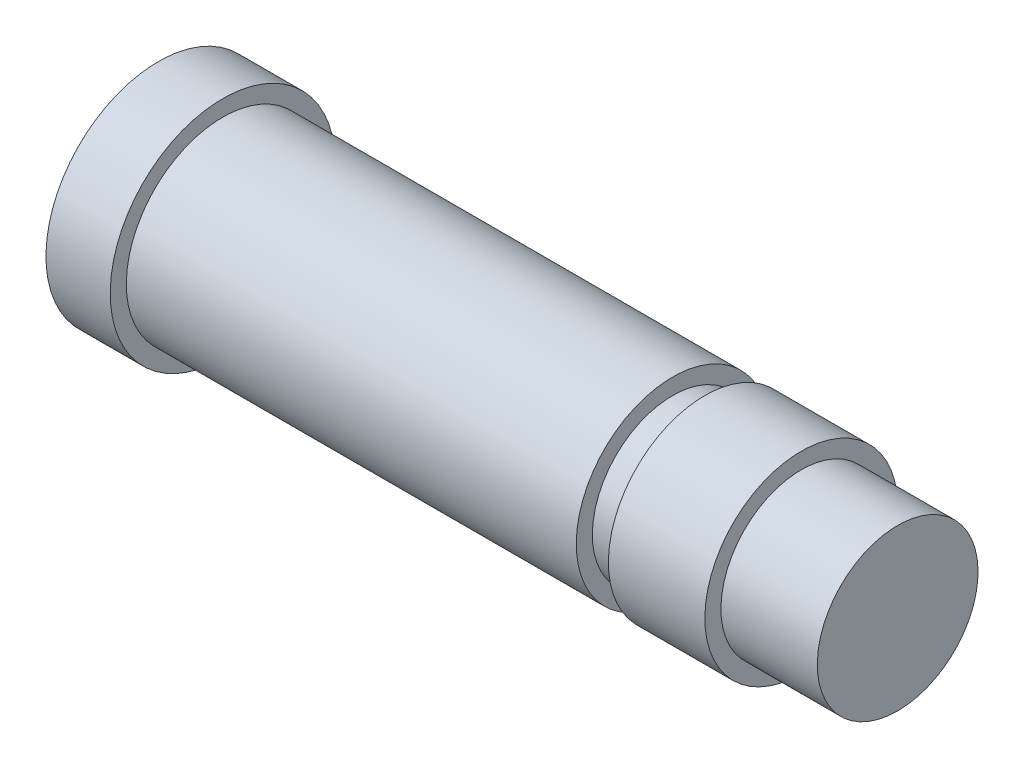
ISO-10303-21;
HEADER;
FILE_DESCRIPTION(('STEP AP214'),'2;1');
FILE_NAME('part.step','',(''),(''),'','','');
FILE_SCHEMA(('AUTOMOTIVE_DESIGN { 1 0 10303 214 1 1 1 1 }'));
ENDSEC;
DATA;
#1=APPLICATION_CONTEXT('core data for automotive mechanical design processes');
#2=APPLICATION_PROTOCOL_DEFINITION('international standard','automotive_design',2000,#1);
#3=PRODUCT_CONTEXT('',#1,'mechanical');
#4=PRODUCT('Part','Part','',(#3));
#5=PRODUCT_RELATED_PRODUCT_CATEGORY('part','',(#4));
#6=PRODUCT_DEFINITION_FORMATION('','',#4);
#7=PRODUCT_DEFINITION_CONTEXT('part definition',#1,'design');
#8=PRODUCT_DEFINITION('design','',#6,#7);
#9=PRODUCT_DEFINITION_SHAPE('','',#8);
#10=(LENGTH_UNIT() NAMED_UNIT(*) SI_UNIT(.MILLI.,.METRE.));
#11=(NAMED_UNIT(*) PLANE_ANGLE_UNIT() SI_UNIT($,.RADIAN.));
#12=(NAMED_UNIT(*) SI_UNIT($,.STERADIAN.) SOLID_ANGLE_UNIT());
#13=UNCERTAINTY_MEASURE_WITH_UNIT(LENGTH_MEASURE(1.E-05),#10,'distance_accuracy_value','');
#14=(GEOMETRIC_REPRESENTATION_CONTEXT(3) GLOBAL_UNCERTAINTY_ASSIGNED_CONTEXT((#13)) GLOBAL_UNIT_ASSIGNED_CONTEXT((#10,
#11,#12)) REPRESENTATION_CONTEXT('',''));
#15=CARTESIAN_POINT('',(0.,0.,0.));
#16=DIRECTION('',(0.,0.,1.));
#17=DIRECTION('',(1.,0.,0.));
#18=AXIS2_PLACEMENT_3D('',#15,#16,#17);
#19=CARTESIAN_POINT('',(0.,7.,0.));
#20=DIRECTION('',(1.,0.,0.));
#21=DIRECTION('',(0.,1.,0.));
#22=AXIS2_PLACEMENT_3D('',#19,#20,#21);
#23=PLANE('',#22);
#24=CARTESIAN_POINT('',(0.,0.,0.));
#25=DIRECTION('',(-1.,0.,0.));
#26=DIRECTION('',(0.,-1.,0.));
#27=AXIS2_PLACEMENT_3D('',#24,#25,#26);
#28=CIRCLE('',#27,7.);
#29=CARTESIAN_POINT('',(0.,-7.,0.));
#30=VERTEX_POINT('',#29);
#31=EDGE_CURVE('E92',#30,#30,#28,.T.);
#32=ORIENTED_EDGE('',*,*,#31,.T.);
#33=EDGE_LOOP('',(#32));
#34=FACE_BOUND('',#33,.T.);
#35=ADVANCED_FACE('F49',(#34),#23,.F.);
#36=CARTESIAN_POINT('',(46.,5.00000000000001,0.));
#37=DIRECTION('',(-1.,0.,0.));
#38=DIRECTION('',(0.,-1.,0.));
#39=AXIS2_PLACEMENT_3D('',#36,#37,#38);
#40=PLANE('',#39);
#41=CARTESIAN_POINT('',(46.,0.,0.));
#42=DIRECTION('',(-1.,0.,0.));
#43=DIRECTION('',(0.,-1.,0.));
#44=AXIS2_PLACEMENT_3D('',#41,#42,#43);
#45=CIRCLE('',#44,5.);
#46=CARTESIAN_POINT('',(46.,-5.,0.));
#47=VERTEX_POINT('',#46);
#48=EDGE_CURVE('E10',#47,#47,#45,.T.);
#49=ORIENTED_EDGE('',*,*,#48,.F.);
#50=EDGE_LOOP('',(#49));
#51=FACE_BOUND('',#50,.T.);
#52=ADVANCED_FACE('F148',(#51),#40,.F.);
#53=CARTESIAN_POINT('',(0.,0.,0.));
#54=DIRECTION('',(-1.,0.,0.));
#55=DIRECTION('',(0.,-1.,0.));
#56=AXIS2_PLACEMENT_3D('',#53,#54,#55);
#57=CYLINDRICAL_SURFACE('',#56,5.);
#58=CARTESIAN_POINT('',(40.,0.,0.));
#59=DIRECTION('',(-1.,0.,0.));
#60=DIRECTION('',(0.,-1.,0.));
#61=AXIS2_PLACEMENT_3D('',#58,#59,#60);
#62=CIRCLE('',#61,5.);
#63=CARTESIAN_POINT('',(40.,-4.99999999999999,0.));
#64=VERTEX_POINT('',#63);
#65=EDGE_CURVE('E56',#64,#64,#62,.T.);
#66=ORIENTED_EDGE('',*,*,#65,.F.);
#67=EDGE_LOOP('',(#66));
#68=FACE_BOUND('',#67,.T.);
#69=ORIENTED_EDGE('',*,*,#48,.T.);
#70=EDGE_LOOP('',(#69));
#71=FACE_BOUND('',#70,.T.);
#72=ADVANCED_FACE('F142',(#68,#71),#57,.T.);
#73=CARTESIAN_POINT('',(40.,5.,0.));
#74=DIRECTION('',(-1.,0.,0.));
#75=DIRECTION('',(0.,-1.,0.));
#76=AXIS2_PLACEMENT_3D('',#73,#74,#75);
#77=PLANE('',#76);
#78=CARTESIAN_POINT('',(40.,0.,0.));
#79=DIRECTION('',(-1.,0.,0.));
#80=DIRECTION('',(0.,-1.,0.));
#81=AXIS2_PLACEMENT_3D('',#78,#79,#80);
#82=CIRCLE('',#81,6.);
#83=CARTESIAN_POINT('',(40.,-6.,0.));
#84=VERTEX_POINT('',#83);
#85=EDGE_CURVE('E61',#84,#84,#82,.T.);
#86=ORIENTED_EDGE('',*,*,#85,.F.);
#87=EDGE_LOOP('',(#86));
#88=FACE_BOUND('',#87,.T.);
#89=ORIENTED_EDGE('',*,*,#65,.T.);
#90=EDGE_LOOP('',(#89));
#91=FACE_BOUND('',#90,.T.);
#92=ADVANCED_FACE('F137',(#88,#91),#77,.F.);
#93=CARTESIAN_POINT('',(0.,0.,0.));
#94=DIRECTION('',(-1.,0.,0.));
#95=DIRECTION('',(0.,-1.,0.));
#96=AXIS2_PLACEMENT_3D('',#93,#94,#95);
#97=CYLINDRICAL_SURFACE('',#96,6.);
#98=CARTESIAN_POINT('',(34.,0.,0.));
#99=DIRECTION('',(-1.,0.,0.));
#100=DIRECTION('',(0.,-1.,0.));
#101=AXIS2_PLACEMENT_3D('',#98,#99,#100);
#102=CIRCLE('',#101,6.);
#103=CARTESIAN_POINT('',(34.,-5.99999999999999,0.));
#104=VERTEX_POINT('',#103);
#105=EDGE_CURVE('E66',#104,#104,#102,.T.);
#106=ORIENTED_EDGE('',*,*,#105,.F.);
#107=EDGE_LOOP('',(#106));
#108=FACE_BOUND('',#107,.T.);
#109=ORIENTED_EDGE('',*,*,#85,.T.);
#110=EDGE_LOOP('',(#109));
#111=FACE_BOUND('',#110,.T.);
#112=ADVANCED_FACE('F131',(#108,#111),#97,.T.);
#113=CARTESIAN_POINT('',(34.,6.,0.));
#114=DIRECTION('',(1.,0.,0.));
#115=DIRECTION('',(0.,1.,0.));
#116=AXIS2_PLACEMENT_3D('',#113,#114,#115);
#117=PLANE('',#116);
#118=CARTESIAN_POINT('',(34.,0.,0.));
#119=DIRECTION('',(-1.,0.,0.));
#120=DIRECTION('',(0.,-1.,0.));
#121=AXIS2_PLACEMENT_3D('',#118,#119,#120);
#122=CIRCLE('',#121,5.);
#123=CARTESIAN_POINT('',(34.,-4.99999999999999,0.));
#124=VERTEX_POINT('',#123);
#125=EDGE_CURVE('E72',#124,#124,#122,.T.);
#126=ORIENTED_EDGE('',*,*,#125,.F.);
#127=EDGE_LOOP('',(#126));
#128=FACE_BOUND('',#127,.T.);
#129=ORIENTED_EDGE('',*,*,#105,.T.);
#130=EDGE_LOOP('',(#129));
#131=FACE_BOUND('',#130,.T.);
#132=ADVANCED_FACE('F125',(#128,#131),#117,.F.);
#133=CARTESIAN_POINT('',(0.,0.,0.));
#134=DIRECTION('',(-1.,0.,0.));
#135=DIRECTION('',(0.,-1.,0.));
#136=AXIS2_PLACEMENT_3D('',#133,#134,#135);
#137=CYLINDRICAL_SURFACE('',#136,5.);
#138=CARTESIAN_POINT('',(32.,0.,0.));
#139=DIRECTION('',(-1.,0.,0.));
#140=DIRECTION('',(0.,-1.,0.));
#141=AXIS2_PLACEMENT_3D('',#138,#139,#140);
#142=CIRCLE('',#141,5.);
#143=CARTESIAN_POINT('',(32.,-4.99999999999999,0.));
#144=VERTEX_POINT('',#143);
#145=EDGE_CURVE('E76',#144,#144,#142,.T.);
#146=ORIENTED_EDGE('',*,*,#145,.F.);
#147=EDGE_LOOP('',(#146));
#148=FACE_BOUND('',#147,.T.);
#149=ORIENTED_EDGE('',*,*,#125,.T.);
#150=EDGE_LOOP('',(#149));
#151=FACE_BOUND('',#150,.T.);
#152=ADVANCED_FACE('F119',(#148,#151),#137,.T.);
#153=CARTESIAN_POINT('',(32.,5.,0.));
#154=DIRECTION('',(-1.,0.,0.));
#155=DIRECTION('',(0.,-1.,0.));
#156=AXIS2_PLACEMENT_3D('',#153,#154,#155);
#157=PLANE('',#156);
#158=CARTESIAN_POINT('',(32.,0.,0.));
#159=DIRECTION('',(-1.,0.,0.));
#160=DIRECTION('',(0.,-1.,0.));
#161=AXIS2_PLACEMENT_3D('',#158,#159,#160);
#162=CIRCLE('',#161,6.);
#163=CARTESIAN_POINT('',(32.,-6.,0.));
#164=VERTEX_POINT('',#163);
#165=EDGE_CURVE('E80',#164,#164,#162,.T.);
#166=ORIENTED_EDGE('',*,*,#165,.F.);
#167=EDGE_LOOP('',(#166));
#168=FACE_BOUND('',#167,.T.);
#169=ORIENTED_EDGE('',*,*,#145,.T.);
#170=EDGE_LOOP('',(#169));
#171=FACE_BOUND('',#170,.T.);
#172=ADVANCED_FACE('F113',(#168,#171),#157,.F.);
#173=CARTESIAN_POINT('',(0.,0.,0.));
#174=DIRECTION('',(-1.,0.,0.));
#175=DIRECTION('',(0.,-1.,0.));
#176=AXIS2_PLACEMENT_3D('',#173,#174,#175);
#177=CYLINDRICAL_SURFACE('',#176,6.);
#178=CARTESIAN_POINT('',(4.,0.,0.));
#179=DIRECTION('',(-1.,0.,0.));
#180=DIRECTION('',(0.,-1.,0.));
#181=AXIS2_PLACEMENT_3D('',#178,#179,#180);
#182=CIRCLE('',#181,6.);
#183=CARTESIAN_POINT('',(4.,-6.,0.));
#184=VERTEX_POINT('',#183);
#185=EDGE_CURVE('E84',#184,#184,#182,.T.);
#186=ORIENTED_EDGE('',*,*,#185,.F.);
#187=EDGE_LOOP('',(#186));
#188=FACE_BOUND('',#187,.T.);
#189=ORIENTED_EDGE('',*,*,#165,.T.);
#190=EDGE_LOOP('',(#189));
#191=FACE_BOUND('',#190,.T.);
#192=ADVANCED_FACE('F107',(#188,#191),#177,.T.);
#193=CARTESIAN_POINT('',(4.,6.,0.));
#194=DIRECTION('',(-1.,0.,0.));
#195=DIRECTION('',(0.,-1.,0.));
#196=AXIS2_PLACEMENT_3D('',#193,#194,#195);
#197=PLANE('',#196);
#198=CARTESIAN_POINT('',(4.,0.,0.));
#199=DIRECTION('',(-1.,0.,0.));
#200=DIRECTION('',(0.,-1.,0.));
#201=AXIS2_PLACEMENT_3D('',#198,#199,#200);
#202=CIRCLE('',#201,7.);
#203=CARTESIAN_POINT('',(4.,-7.,0.));
#204=VERTEX_POINT('',#203);
#205=EDGE_CURVE('E88',#204,#204,#202,.T.);
#206=ORIENTED_EDGE('',*,*,#205,.F.);
#207=EDGE_LOOP('',(#206));
#208=FACE_BOUND('',#207,.T.);
#209=ORIENTED_EDGE('',*,*,#185,.T.);
#210=EDGE_LOOP('',(#209));
#211=FACE_BOUND('',#210,.T.);
#212=ADVANCED_FACE('F101',(#208,#211),#197,.F.);
#213=CARTESIAN_POINT('',(0.,0.,0.));
#214=DIRECTION('',(-1.,0.,0.));
#215=DIRECTION('',(0.,-1.,0.));
#216=AXIS2_PLACEMENT_3D('',#213,#214,#215);
#217=CYLINDRICAL_SURFACE('',#216,7.);
#218=ORIENTED_EDGE('',*,*,#31,.F.);
#219=EDGE_LOOP('',(#218));
#220=FACE_BOUND('',#219,.T.);
#221=ORIENTED_EDGE('',*,*,#205,.T.);
#222=EDGE_LOOP('',(#221));
#223=FACE_BOUND('',#222,.T.);
#224=ADVANCED_FACE('F98',(#220,#223),#217,.T.);
#225=CLOSED_SHELL('',(#35,#52,#72,#92,#112,#132,#152,#172,#192,#212,#224));
#226=MANIFOLD_SOLID_BREP('B2',#225);
#227=ADVANCED_BREP_SHAPE_REPRESENTATION('',(#18,#226),#14);
#228=SHAPE_DEFINITION_REPRESENTATION(#9,#227);
ENDSEC;
END-ISO-10303-21;
